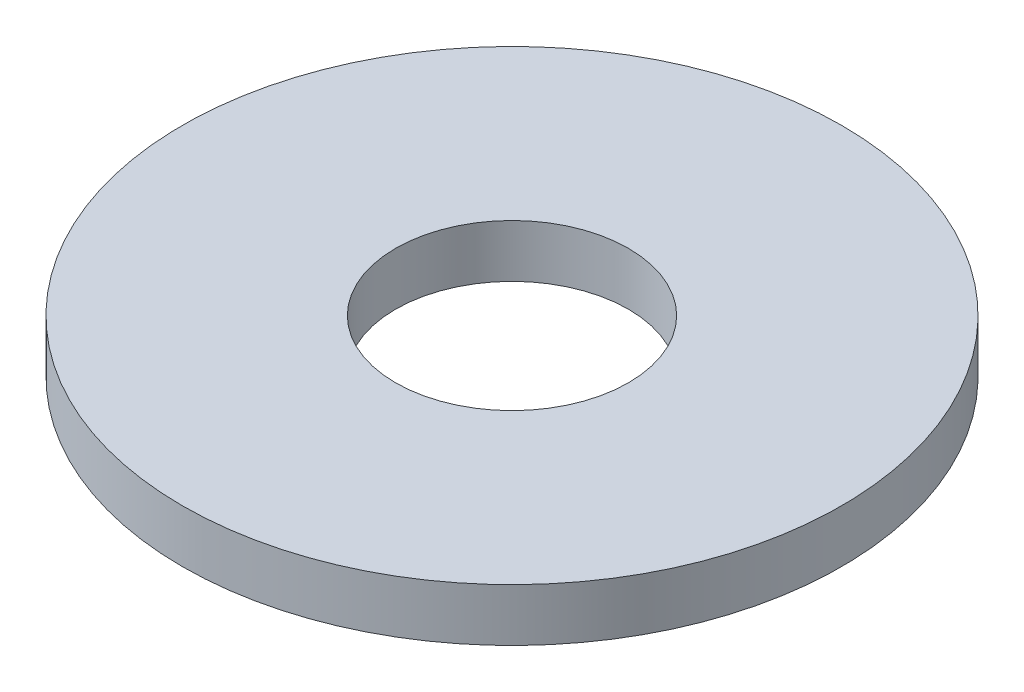
ISO-10303-21;
HEADER;
FILE_DESCRIPTION(('STEP AP214'),'2;1');
FILE_NAME('part.step','',(''),(''),'','','');
FILE_SCHEMA(('AUTOMOTIVE_DESIGN { 1 0 10303 214 1 1 1 1 }'));
ENDSEC;
DATA;
#1=APPLICATION_CONTEXT('core data for automotive mechanical design processes');
#2=APPLICATION_PROTOCOL_DEFINITION('international standard','automotive_design',2000,#1);
#3=PRODUCT_CONTEXT('',#1,'mechanical');
#4=PRODUCT('Part','Part','',(#3));
#5=PRODUCT_RELATED_PRODUCT_CATEGORY('part','',(#4));
#6=PRODUCT_DEFINITION_FORMATION('','',#4);
#7=PRODUCT_DEFINITION_CONTEXT('part definition',#1,'design');
#8=PRODUCT_DEFINITION('design','',#6,#7);
#9=PRODUCT_DEFINITION_SHAPE('','',#8);
#10=(LENGTH_UNIT() NAMED_UNIT(*) SI_UNIT(.MILLI.,.METRE.));
#11=(NAMED_UNIT(*) PLANE_ANGLE_UNIT() SI_UNIT($,.RADIAN.));
#12=(NAMED_UNIT(*) SI_UNIT($,.STERADIAN.) SOLID_ANGLE_UNIT());
#13=UNCERTAINTY_MEASURE_WITH_UNIT(LENGTH_MEASURE(1.E-05),#10,'distance_accuracy_value','');
#14=(GEOMETRIC_REPRESENTATION_CONTEXT(3) GLOBAL_UNCERTAINTY_ASSIGNED_CONTEXT((#13)) GLOBAL_UNIT_ASSIGNED_CONTEXT((#10,
#11,#12)) REPRESENTATION_CONTEXT('',''));
#15=CARTESIAN_POINT('',(0.,0.,0.));
#16=DIRECTION('',(0.,0.,1.));
#17=DIRECTION('',(1.,0.,0.));
#18=AXIS2_PLACEMENT_3D('',#15,#16,#17);
#19=CARTESIAN_POINT('',(0.,1.2,0.));
#20=DIRECTION('',(0.,1.,0.));
#21=DIRECTION('',(0.,0.,1.));
#22=AXIS2_PLACEMENT_3D('',#19,#20,#21);
#23=PLANE('',#22);
#24=CARTESIAN_POINT('',(0.,1.2,0.));
#25=DIRECTION('',(0.,1.,0.));
#26=DIRECTION('',(0.,0.,1.));
#27=AXIS2_PLACEMENT_3D('',#24,#25,#26);
#28=CIRCLE('',#27,7.5);
#29=CARTESIAN_POINT('',(0.,1.2,7.5));
#30=VERTEX_POINT('',#29);
#31=EDGE_CURVE('E10',#30,#30,#28,.T.);
#32=ORIENTED_EDGE('',*,*,#31,.T.);
#33=EDGE_LOOP('',(#32));
#34=FACE_BOUND('',#33,.T.);
#35=CARTESIAN_POINT('',(0.,1.2,0.));
#36=DIRECTION('',(0.,1.,0.));
#37=DIRECTION('',(0.,0.,1.));
#38=AXIS2_PLACEMENT_3D('',#35,#36,#37);
#39=CIRCLE('',#38,2.65);
#40=CARTESIAN_POINT('',(0.,1.2,2.65));
#41=VERTEX_POINT('',#40);
#42=EDGE_CURVE('E42',#41,#41,#39,.T.);
#43=ORIENTED_EDGE('',*,*,#42,.F.);
#44=EDGE_LOOP('',(#43));
#45=FACE_BOUND('',#44,.T.);
#46=ADVANCED_FACE('F31',(#34,#45),#23,.T.);
#47=CARTESIAN_POINT('',(0.,0.,0.));
#48=DIRECTION('',(0.,1.,0.));
#49=DIRECTION('',(0.,0.,1.));
#50=AXIS2_PLACEMENT_3D('',#47,#48,#49);
#51=PLANE('',#50);
#52=CARTESIAN_POINT('',(0.,0.,0.));
#53=DIRECTION('',(0.,1.,0.));
#54=DIRECTION('',(0.,0.,1.));
#55=AXIS2_PLACEMENT_3D('',#52,#53,#54);
#56=CIRCLE('',#55,7.5);
#57=CARTESIAN_POINT('',(0.,0.,7.5));
#58=VERTEX_POINT('',#57);
#59=EDGE_CURVE('E35',#58,#58,#56,.T.);
#60=ORIENTED_EDGE('',*,*,#59,.F.);
#61=EDGE_LOOP('',(#60));
#62=FACE_BOUND('',#61,.T.);
#63=CARTESIAN_POINT('',(0.,0.,0.));
#64=DIRECTION('',(0.,1.,0.));
#65=DIRECTION('',(0.,0.,1.));
#66=AXIS2_PLACEMENT_3D('',#63,#64,#65);
#67=CIRCLE('',#66,2.65);
#68=CARTESIAN_POINT('',(0.,0.,2.65));
#69=VERTEX_POINT('',#68);
#70=EDGE_CURVE('E44',#69,#69,#67,.T.);
#71=ORIENTED_EDGE('',*,*,#70,.T.);
#72=EDGE_LOOP('',(#71));
#73=FACE_BOUND('',#72,.T.);
#74=ADVANCED_FACE('F54',(#62,#73),#51,.F.);
#75=CARTESIAN_POINT('',(0.,1.2,0.));
#76=DIRECTION('',(0.,-1.,0.));
#77=DIRECTION('',(0.,0.,-1.));
#78=AXIS2_PLACEMENT_3D('',#75,#76,#77);
#79=CYLINDRICAL_SURFACE('',#78,7.5);
#80=ORIENTED_EDGE('',*,*,#31,.F.);
#81=EDGE_LOOP('',(#80));
#82=FACE_BOUND('',#81,.T.);
#83=ORIENTED_EDGE('',*,*,#59,.T.);
#84=EDGE_LOOP('',(#83));
#85=FACE_BOUND('',#84,.T.);
#86=ADVANCED_FACE('F33',(#82,#85),#79,.T.);
#87=CARTESIAN_POINT('',(0.,1.2,0.));
#88=DIRECTION('',(0.,-1.,0.));
#89=DIRECTION('',(0.,0.,-1.));
#90=AXIS2_PLACEMENT_3D('',#87,#88,#89);
#91=CYLINDRICAL_SURFACE('',#90,2.65);
#92=ORIENTED_EDGE('',*,*,#42,.T.);
#93=EDGE_LOOP('',(#92));
#94=FACE_BOUND('',#93,.T.);
#95=ORIENTED_EDGE('',*,*,#70,.F.);
#96=EDGE_LOOP('',(#95));
#97=FACE_BOUND('',#96,.T.);
#98=ADVANCED_FACE('F50',(#94,#97),#91,.F.);
#99=CLOSED_SHELL('',(#46,#74,#86,#98));
#100=MANIFOLD_SOLID_BREP('B2',#99);
#101=ADVANCED_BREP_SHAPE_REPRESENTATION('',(#18,#100),#14);
#102=SHAPE_DEFINITION_REPRESENTATION(#9,#101);
ENDSEC;
END-ISO-10303-21;
